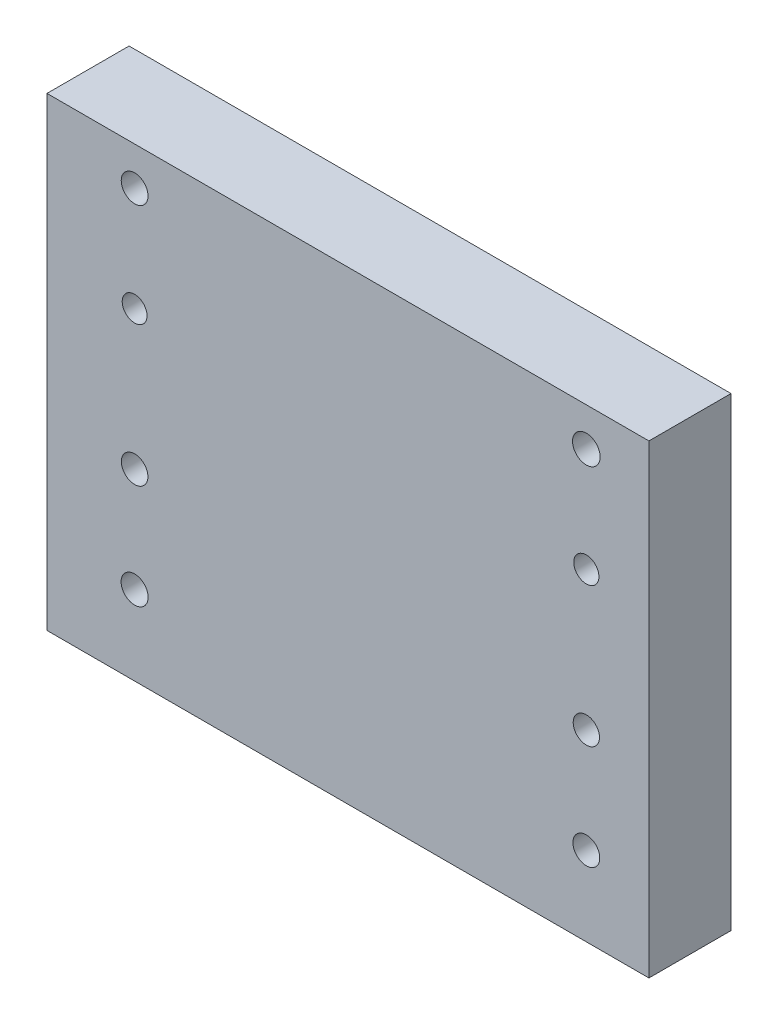
ISO-10303-21;
HEADER;
FILE_DESCRIPTION(('STEP AP214'),'2;1');
FILE_NAME('part.step','',(''),(''),'','','');
FILE_SCHEMA(('AUTOMOTIVE_DESIGN { 1 0 10303 214 1 1 1 1 }'));
ENDSEC;
DATA;
#1=APPLICATION_CONTEXT('core data for automotive mechanical design processes');
#2=APPLICATION_PROTOCOL_DEFINITION('international standard','automotive_design',2000,#1);
#3=PRODUCT_CONTEXT('',#1,'mechanical');
#4=PRODUCT('Part','Part','',(#3));
#5=PRODUCT_RELATED_PRODUCT_CATEGORY('part','',(#4));
#6=PRODUCT_DEFINITION_FORMATION('','',#4);
#7=PRODUCT_DEFINITION_CONTEXT('part definition',#1,'design');
#8=PRODUCT_DEFINITION('design','',#6,#7);
#9=PRODUCT_DEFINITION_SHAPE('','',#8);
#10=(LENGTH_UNIT() NAMED_UNIT(*) SI_UNIT(.MILLI.,.METRE.));
#11=(NAMED_UNIT(*) PLANE_ANGLE_UNIT() SI_UNIT($,.RADIAN.));
#12=(NAMED_UNIT(*) SI_UNIT($,.STERADIAN.) SOLID_ANGLE_UNIT());
#13=UNCERTAINTY_MEASURE_WITH_UNIT(LENGTH_MEASURE(1.E-05),#10,'distance_accuracy_value','');
#14=(GEOMETRIC_REPRESENTATION_CONTEXT(3) GLOBAL_UNCERTAINTY_ASSIGNED_CONTEXT((#13)) GLOBAL_UNIT_ASSIGNED_CONTEXT((#10,
#11,#12)) REPRESENTATION_CONTEXT('',''));
#15=CARTESIAN_POINT('',(0.,0.,0.));
#16=DIRECTION('',(0.,0.,1.));
#17=DIRECTION('',(1.,0.,0.));
#18=AXIS2_PLACEMENT_3D('',#15,#16,#17);
#19=CARTESIAN_POINT('',(0.,0.,30.));
#20=DIRECTION('',(1.,0.,0.));
#21=DIRECTION('',(0.,0.,-1.));
#22=AXIS2_PLACEMENT_3D('',#19,#20,#21);
#23=PLANE('',#22);
#24=DIRECTION('',(0.,-1.,0.));
#25=VECTOR('',#24,1.);
#26=CARTESIAN_POINT('',(0.,0.,0.));
#27=LINE('',#26,#25);
#28=CARTESIAN_POINT('',(0.,170.,0.));
#29=VERTEX_POINT('',#28);
#30=CARTESIAN_POINT('',(0.,0.,0.));
#31=VERTEX_POINT('',#30);
#32=EDGE_CURVE('E96',#29,#31,#27,.T.);
#33=ORIENTED_EDGE('',*,*,#32,.T.);
#34=DIRECTION('',(0.,0.,-1.));
#35=VECTOR('',#34,1.);
#36=CARTESIAN_POINT('',(0.,0.,30.));
#37=LINE('',#36,#35);
#38=CARTESIAN_POINT('',(0.,0.,30.));
#39=VERTEX_POINT('',#38);
#40=EDGE_CURVE('E11',#39,#31,#37,.T.);
#41=ORIENTED_EDGE('',*,*,#40,.F.);
#42=DIRECTION('',(0.,-1.,0.));
#43=VECTOR('',#42,1.);
#44=CARTESIAN_POINT('',(0.,0.,30.));
#45=LINE('',#44,#43);
#46=CARTESIAN_POINT('',(0.,170.,30.));
#47=VERTEX_POINT('',#46);
#48=EDGE_CURVE('E84',#47,#39,#45,.T.);
#49=ORIENTED_EDGE('',*,*,#48,.F.);
#50=DIRECTION('',(0.,0.,-1.));
#51=VECTOR('',#50,1.);
#52=CARTESIAN_POINT('',(0.,170.,30.));
#53=LINE('',#52,#51);
#54=EDGE_CURVE('E92',#47,#29,#53,.T.);
#55=ORIENTED_EDGE('',*,*,#54,.T.);
#56=EDGE_LOOP('',(#33,#41,#49,#55));
#57=FACE_BOUND('',#56,.T.);
#58=ADVANCED_FACE('F33',(#57),#23,.F.);
#59=CARTESIAN_POINT('',(0.,0.,30.));
#60=DIRECTION('',(0.,1.,0.));
#61=DIRECTION('',(0.,0.,1.));
#62=AXIS2_PLACEMENT_3D('',#59,#60,#61);
#63=PLANE('',#62);
#64=DIRECTION('',(1.,0.,0.));
#65=VECTOR('',#64,1.);
#66=CARTESIAN_POINT('',(0.,0.,0.));
#67=LINE('',#66,#65);
#68=CARTESIAN_POINT('',(220.,0.,0.));
#69=VERTEX_POINT('',#68);
#70=EDGE_CURVE('E88',#31,#69,#67,.T.);
#71=ORIENTED_EDGE('',*,*,#70,.T.);
#72=DIRECTION('',(0.,0.,-1.));
#73=VECTOR('',#72,1.);
#74=CARTESIAN_POINT('',(220.,0.,30.));
#75=LINE('',#74,#73);
#76=CARTESIAN_POINT('',(220.,0.,30.));
#77=VERTEX_POINT('',#76);
#78=EDGE_CURVE('E41',#77,#69,#75,.T.);
#79=ORIENTED_EDGE('',*,*,#78,.F.);
#80=DIRECTION('',(1.,0.,0.));
#81=VECTOR('',#80,1.);
#82=CARTESIAN_POINT('',(0.,0.,30.));
#83=LINE('',#82,#81);
#84=EDGE_CURVE('E79',#39,#77,#83,.T.);
#85=ORIENTED_EDGE('',*,*,#84,.F.);
#86=ORIENTED_EDGE('',*,*,#40,.T.);
#87=EDGE_LOOP('',(#71,#79,#85,#86));
#88=FACE_BOUND('',#87,.T.);
#89=ADVANCED_FACE('F87',(#88),#63,.F.);
#90=CARTESIAN_POINT('',(220.,0.,30.));
#91=DIRECTION('',(-1.,0.,0.));
#92=DIRECTION('',(0.,0.,1.));
#93=AXIS2_PLACEMENT_3D('',#90,#91,#92);
#94=PLANE('',#93);
#95=DIRECTION('',(0.,1.,0.));
#96=VECTOR('',#95,1.);
#97=CARTESIAN_POINT('',(220.,0.,0.));
#98=LINE('',#97,#96);
#99=CARTESIAN_POINT('',(220.,170.,0.));
#100=VERTEX_POINT('',#99);
#101=EDGE_CURVE('E66',#69,#100,#98,.T.);
#102=ORIENTED_EDGE('',*,*,#101,.T.);
#103=DIRECTION('',(0.,0.,-1.));
#104=VECTOR('',#103,1.);
#105=CARTESIAN_POINT('',(220.,170.,30.));
#106=LINE('',#105,#104);
#107=CARTESIAN_POINT('',(220.,170.,30.));
#108=VERTEX_POINT('',#107);
#109=EDGE_CURVE('E89',#108,#100,#106,.T.);
#110=ORIENTED_EDGE('',*,*,#109,.F.);
#111=DIRECTION('',(0.,1.,0.));
#112=VECTOR('',#111,1.);
#113=CARTESIAN_POINT('',(220.,0.,30.));
#114=LINE('',#113,#112);
#115=EDGE_CURVE('E82',#77,#108,#114,.T.);
#116=ORIENTED_EDGE('',*,*,#115,.F.);
#117=ORIENTED_EDGE('',*,*,#78,.T.);
#118=EDGE_LOOP('',(#102,#110,#116,#117));
#119=FACE_BOUND('',#118,.T.);
#120=ADVANCED_FACE('F90',(#119),#94,.F.);
#121=CARTESIAN_POINT('',(0.,170.,30.));
#122=DIRECTION('',(0.,-1.,0.));
#123=DIRECTION('',(0.,0.,-1.));
#124=AXIS2_PLACEMENT_3D('',#121,#122,#123);
#125=PLANE('',#124);
#126=DIRECTION('',(-1.,0.,0.));
#127=VECTOR('',#126,1.);
#128=CARTESIAN_POINT('',(0.,170.,0.));
#129=LINE('',#128,#127);
#130=EDGE_CURVE('E72',#100,#29,#129,.T.);
#131=ORIENTED_EDGE('',*,*,#130,.T.);
#132=ORIENTED_EDGE('',*,*,#54,.F.);
#133=DIRECTION('',(-1.,0.,0.));
#134=VECTOR('',#133,1.);
#135=CARTESIAN_POINT('',(0.,170.,30.));
#136=LINE('',#135,#134);
#137=EDGE_CURVE('E49',#108,#47,#136,.T.);
#138=ORIENTED_EDGE('',*,*,#137,.F.);
#139=ORIENTED_EDGE('',*,*,#109,.T.);
#140=EDGE_LOOP('',(#131,#132,#138,#139));
#141=FACE_BOUND('',#140,.T.);
#142=ADVANCED_FACE('F104',(#141),#125,.F.);
#143=CARTESIAN_POINT('',(0.,0.,30.));
#144=DIRECTION('',(0.,0.,-1.));
#145=DIRECTION('',(-1.,0.,0.));
#146=AXIS2_PLACEMENT_3D('',#143,#144,#145);
#147=PLANE('',#146);
#148=CARTESIAN_POINT('',(197.125064526776,67.0767298248199,30.));
#149=DIRECTION('',(0.,0.,-1.));
#150=DIRECTION('',(-1.,0.,0.));
#151=AXIS2_PLACEMENT_3D('',#148,#149,#150);
#152=CIRCLE('',#151,4.80160975387124);
#153=CARTESIAN_POINT('',(192.323454772905,67.0767298248199,30.));
#154=VERTEX_POINT('',#153);
#155=EDGE_CURVE('E113',#154,#154,#152,.T.);
#156=ORIENTED_EDGE('',*,*,#155,.T.);
#157=EDGE_LOOP('',(#156));
#158=FACE_BOUND('',#157,.T.);
#159=CARTESIAN_POINT('',(197.125064526776,117.87672982482,30.));
#160=DIRECTION('',(0.,0.,-1.));
#161=DIRECTION('',(-1.,0.,0.));
#162=AXIS2_PLACEMENT_3D('',#159,#160,#161);
#163=CIRCLE('',#162,4.59981141049048);
#164=CARTESIAN_POINT('',(192.525253116286,117.87672982482,30.));
#165=VERTEX_POINT('',#164);
#166=EDGE_CURVE('E132',#165,#165,#163,.T.);
#167=ORIENTED_EDGE('',*,*,#166,.T.);
#168=EDGE_LOOP('',(#167));
#169=FACE_BOUND('',#168,.T.);
#170=CARTESIAN_POINT('',(197.125064526776,155.97672982482,30.));
#171=DIRECTION('',(0.,0.,-1.));
#172=DIRECTION('',(-1.,0.,0.));
#173=AXIS2_PLACEMENT_3D('',#170,#171,#172);
#174=CIRCLE('',#173,5.04719194809975);
#175=CARTESIAN_POINT('',(192.077872578677,155.97672982482,30.));
#176=VERTEX_POINT('',#175);
#177=EDGE_CURVE('E126',#176,#176,#174,.T.);
#178=ORIENTED_EDGE('',*,*,#177,.T.);
#179=EDGE_LOOP('',(#178));
#180=FACE_BOUND('',#179,.T.);
#181=CARTESIAN_POINT('',(32.0250645267763,155.97672982482,30.));
#182=DIRECTION('',(0.,0.,-1.));
#183=DIRECTION('',(-1.,0.,0.));
#184=AXIS2_PLACEMENT_3D('',#181,#182,#183);
#185=CIRCLE('',#184,4.89669060810815);
#186=CARTESIAN_POINT('',(27.1283739186682,155.97672982482,30.));
#187=VERTEX_POINT('',#186);
#188=EDGE_CURVE('E119',#187,#187,#185,.T.);
#189=ORIENTED_EDGE('',*,*,#188,.T.);
#190=EDGE_LOOP('',(#189));
#191=FACE_BOUND('',#190,.T.);
#192=CARTESIAN_POINT('',(32.0250645267763,117.87672982482,30.));
#193=DIRECTION('',(0.,0.,-1.));
#194=DIRECTION('',(-1.,0.,0.));
#195=AXIS2_PLACEMENT_3D('',#192,#193,#194);
#196=CIRCLE('',#195,4.54013034751855);
#197=CARTESIAN_POINT('',(27.4849341792578,117.87672982482,30.));
#198=VERTEX_POINT('',#197);
#199=EDGE_CURVE('E120',#198,#198,#196,.T.);
#200=ORIENTED_EDGE('',*,*,#199,.T.);
#201=EDGE_LOOP('',(#200));
#202=FACE_BOUND('',#201,.T.);
#203=CARTESIAN_POINT('',(32.0250645267761,67.07672982482,30.));
#204=DIRECTION('',(0.,0.,-1.));
#205=DIRECTION('',(-1.,0.,0.));
#206=AXIS2_PLACEMENT_3D('',#203,#204,#205);
#207=CIRCLE('',#206,4.85509926160658);
#208=CARTESIAN_POINT('',(27.1699652651695,67.07672982482,30.));
#209=VERTEX_POINT('',#208);
#210=EDGE_CURVE('E149',#209,#209,#207,.T.);
#211=ORIENTED_EDGE('',*,*,#210,.T.);
#212=EDGE_LOOP('',(#211));
#213=FACE_BOUND('',#212,.T.);
#214=CARTESIAN_POINT('',(32.0250645267764,28.9767298248202,30.));
#215=DIRECTION('',(0.,0.,-1.));
#216=DIRECTION('',(-1.,0.,0.));
#217=AXIS2_PLACEMENT_3D('',#214,#215,#216);
#218=CIRCLE('',#217,4.93965940461493);
#219=CARTESIAN_POINT('',(27.0854051221615,28.9767298248202,30.));
#220=VERTEX_POINT('',#219);
#221=EDGE_CURVE('E143',#220,#220,#218,.T.);
#222=ORIENTED_EDGE('',*,*,#221,.T.);
#223=EDGE_LOOP('',(#222));
#224=FACE_BOUND('',#223,.T.);
#225=CARTESIAN_POINT('',(197.125064526776,28.9767298248199,30.));
#226=DIRECTION('',(0.,0.,-1.));
#227=DIRECTION('',(-1.,0.,0.));
#228=AXIS2_PLACEMENT_3D('',#225,#226,#227);
#229=CIRCLE('',#228,4.90391275369585);
#230=CARTESIAN_POINT('',(192.22115177308,28.9767298248199,30.));
#231=VERTEX_POINT('',#230);
#232=EDGE_CURVE('E99',#231,#231,#229,.T.);
#233=ORIENTED_EDGE('',*,*,#232,.T.);
#234=EDGE_LOOP('',(#233));
#235=FACE_BOUND('',#234,.T.);
#236=ORIENTED_EDGE('',*,*,#48,.T.);
#237=ORIENTED_EDGE('',*,*,#84,.T.);
#238=ORIENTED_EDGE('',*,*,#115,.T.);
#239=ORIENTED_EDGE('',*,*,#137,.T.);
#240=EDGE_LOOP('',(#236,#237,#238,#239));
#241=FACE_BOUND('',#240,.T.);
#242=ADVANCED_FACE('F80',(#158,#169,#180,#191,#202,#213,#224,#235,#241),#147,.F.);
#243=CARTESIAN_POINT('',(0.,0.,0.));
#244=DIRECTION('',(0.,0.,-1.));
#245=DIRECTION('',(-1.,0.,0.));
#246=AXIS2_PLACEMENT_3D('',#243,#244,#245);
#247=PLANE('',#246);
#248=CARTESIAN_POINT('',(197.125064526776,67.0767298248199,0.));
#249=DIRECTION('',(0.,0.,-1.));
#250=DIRECTION('',(-1.,0.,0.));
#251=AXIS2_PLACEMENT_3D('',#248,#249,#250);
#252=CIRCLE('',#251,4.80160975387124);
#253=CARTESIAN_POINT('',(192.323454772905,67.0767298248199,0.));
#254=VERTEX_POINT('',#253);
#255=EDGE_CURVE('E135',#254,#254,#252,.T.);
#256=ORIENTED_EDGE('',*,*,#255,.F.);
#257=EDGE_LOOP('',(#256));
#258=FACE_BOUND('',#257,.T.);
#259=CARTESIAN_POINT('',(197.125064526776,117.87672982482,0.));
#260=DIRECTION('',(0.,0.,-1.));
#261=DIRECTION('',(-1.,0.,0.));
#262=AXIS2_PLACEMENT_3D('',#259,#260,#261);
#263=CIRCLE('',#262,4.59981141049048);
#264=CARTESIAN_POINT('',(192.525253116286,117.87672982482,0.));
#265=VERTEX_POINT('',#264);
#266=EDGE_CURVE('E129',#265,#265,#263,.T.);
#267=ORIENTED_EDGE('',*,*,#266,.F.);
#268=EDGE_LOOP('',(#267));
#269=FACE_BOUND('',#268,.T.);
#270=CARTESIAN_POINT('',(197.125064526776,155.97672982482,0.));
#271=DIRECTION('',(0.,0.,-1.));
#272=DIRECTION('',(-1.,0.,0.));
#273=AXIS2_PLACEMENT_3D('',#270,#271,#272);
#274=CIRCLE('',#273,5.04719194809975);
#275=CARTESIAN_POINT('',(192.077872578677,155.97672982482,0.));
#276=VERTEX_POINT('',#275);
#277=EDGE_CURVE('E123',#276,#276,#274,.T.);
#278=ORIENTED_EDGE('',*,*,#277,.F.);
#279=EDGE_LOOP('',(#278));
#280=FACE_BOUND('',#279,.T.);
#281=CARTESIAN_POINT('',(32.0250645267763,155.97672982482,0.));
#282=DIRECTION('',(0.,0.,-1.));
#283=DIRECTION('',(-1.,0.,0.));
#284=AXIS2_PLACEMENT_3D('',#281,#282,#283);
#285=CIRCLE('',#284,4.89669060810815);
#286=CARTESIAN_POINT('',(27.1283739186682,155.97672982482,0.));
#287=VERTEX_POINT('',#286);
#288=EDGE_CURVE('E116',#287,#287,#285,.T.);
#289=ORIENTED_EDGE('',*,*,#288,.F.);
#290=EDGE_LOOP('',(#289));
#291=FACE_BOUND('',#290,.T.);
#292=CARTESIAN_POINT('',(32.0250645267763,117.87672982482,0.));
#293=DIRECTION('',(0.,0.,-1.));
#294=DIRECTION('',(-1.,0.,0.));
#295=AXIS2_PLACEMENT_3D('',#292,#293,#294);
#296=CIRCLE('',#295,4.54013034751855);
#297=CARTESIAN_POINT('',(27.4849341792578,117.87672982482,0.));
#298=VERTEX_POINT('',#297);
#299=EDGE_CURVE('E152',#298,#298,#296,.T.);
#300=ORIENTED_EDGE('',*,*,#299,.F.);
#301=EDGE_LOOP('',(#300));
#302=FACE_BOUND('',#301,.T.);
#303=CARTESIAN_POINT('',(32.0250645267761,67.07672982482,0.));
#304=DIRECTION('',(0.,0.,-1.));
#305=DIRECTION('',(-1.,0.,0.));
#306=AXIS2_PLACEMENT_3D('',#303,#304,#305);
#307=CIRCLE('',#306,4.85509926160658);
#308=CARTESIAN_POINT('',(27.1699652651695,67.07672982482,0.));
#309=VERTEX_POINT('',#308);
#310=EDGE_CURVE('E146',#309,#309,#307,.T.);
#311=ORIENTED_EDGE('',*,*,#310,.F.);
#312=EDGE_LOOP('',(#311));
#313=FACE_BOUND('',#312,.T.);
#314=CARTESIAN_POINT('',(32.0250645267764,28.9767298248202,0.));
#315=DIRECTION('',(0.,0.,-1.));
#316=DIRECTION('',(-1.,0.,0.));
#317=AXIS2_PLACEMENT_3D('',#314,#315,#316);
#318=CIRCLE('',#317,4.93965940461493);
#319=CARTESIAN_POINT('',(27.0854051221615,28.9767298248202,0.));
#320=VERTEX_POINT('',#319);
#321=EDGE_CURVE('E140',#320,#320,#318,.T.);
#322=ORIENTED_EDGE('',*,*,#321,.F.);
#323=EDGE_LOOP('',(#322));
#324=FACE_BOUND('',#323,.T.);
#325=CARTESIAN_POINT('',(197.125064526776,28.9767298248199,0.));
#326=DIRECTION('',(0.,0.,-1.));
#327=DIRECTION('',(-1.,0.,0.));
#328=AXIS2_PLACEMENT_3D('',#325,#326,#327);
#329=CIRCLE('',#328,4.90391275369585);
#330=CARTESIAN_POINT('',(192.22115177308,28.9767298248199,0.));
#331=VERTEX_POINT('',#330);
#332=EDGE_CURVE('E110',#331,#331,#329,.T.);
#333=ORIENTED_EDGE('',*,*,#332,.F.);
#334=EDGE_LOOP('',(#333));
#335=FACE_BOUND('',#334,.T.);
#336=ORIENTED_EDGE('',*,*,#32,.F.);
#337=ORIENTED_EDGE('',*,*,#130,.F.);
#338=ORIENTED_EDGE('',*,*,#101,.F.);
#339=ORIENTED_EDGE('',*,*,#70,.F.);
#340=EDGE_LOOP('',(#336,#337,#338,#339));
#341=FACE_BOUND('',#340,.T.);
#342=ADVANCED_FACE('F107',(#258,#269,#280,#291,#302,#313,#324,#335,#341),#247,.T.);
#343=CARTESIAN_POINT('',(197.125064526776,28.9767298248199,30.));
#344=DIRECTION('',(0.,0.,-1.));
#345=DIRECTION('',(-1.,0.,0.));
#346=AXIS2_PLACEMENT_3D('',#343,#344,#345);
#347=CYLINDRICAL_SURFACE('',#346,4.90391275369585);
#348=ORIENTED_EDGE('',*,*,#232,.F.);
#349=EDGE_LOOP('',(#348));
#350=FACE_BOUND('',#349,.T.);
#351=ORIENTED_EDGE('',*,*,#332,.T.);
#352=EDGE_LOOP('',(#351));
#353=FACE_BOUND('',#352,.T.);
#354=ADVANCED_FACE('F170',(#350,#353),#347,.F.);
#355=CARTESIAN_POINT('',(32.0250645267764,28.9767298248202,30.));
#356=DIRECTION('',(0.,0.,-1.));
#357=DIRECTION('',(-1.,0.,0.));
#358=AXIS2_PLACEMENT_3D('',#355,#356,#357);
#359=CYLINDRICAL_SURFACE('',#358,4.93965940461493);
#360=ORIENTED_EDGE('',*,*,#221,.F.);
#361=EDGE_LOOP('',(#360));
#362=FACE_BOUND('',#361,.T.);
#363=ORIENTED_EDGE('',*,*,#321,.T.);
#364=EDGE_LOOP('',(#363));
#365=FACE_BOUND('',#364,.T.);
#366=ADVANCED_FACE('F180',(#362,#365),#359,.F.);
#367=CARTESIAN_POINT('',(32.0250645267761,67.07672982482,30.));
#368=DIRECTION('',(0.,0.,-1.));
#369=DIRECTION('',(-1.,0.,0.));
#370=AXIS2_PLACEMENT_3D('',#367,#368,#369);
#371=CYLINDRICAL_SURFACE('',#370,4.85509926160658);
#372=ORIENTED_EDGE('',*,*,#210,.F.);
#373=EDGE_LOOP('',(#372));
#374=FACE_BOUND('',#373,.T.);
#375=ORIENTED_EDGE('',*,*,#310,.T.);
#376=EDGE_LOOP('',(#375));
#377=FACE_BOUND('',#376,.T.);
#378=ADVANCED_FACE('F164',(#374,#377),#371,.F.);
#379=CARTESIAN_POINT('',(32.0250645267763,117.87672982482,30.));
#380=DIRECTION('',(0.,0.,-1.));
#381=DIRECTION('',(-1.,0.,0.));
#382=AXIS2_PLACEMENT_3D('',#379,#380,#381);
#383=CYLINDRICAL_SURFACE('',#382,4.54013034751855);
#384=ORIENTED_EDGE('',*,*,#199,.F.);
#385=EDGE_LOOP('',(#384));
#386=FACE_BOUND('',#385,.T.);
#387=ORIENTED_EDGE('',*,*,#299,.T.);
#388=EDGE_LOOP('',(#387));
#389=FACE_BOUND('',#388,.T.);
#390=ADVANCED_FACE('F160',(#386,#389),#383,.F.);
#391=CARTESIAN_POINT('',(32.0250645267763,155.97672982482,30.));
#392=DIRECTION('',(0.,0.,-1.));
#393=DIRECTION('',(-1.,0.,0.));
#394=AXIS2_PLACEMENT_3D('',#391,#392,#393);
#395=CYLINDRICAL_SURFACE('',#394,4.89669060810815);
#396=ORIENTED_EDGE('',*,*,#188,.F.);
#397=EDGE_LOOP('',(#396));
#398=FACE_BOUND('',#397,.T.);
#399=ORIENTED_EDGE('',*,*,#288,.T.);
#400=EDGE_LOOP('',(#399));
#401=FACE_BOUND('',#400,.T.);
#402=ADVANCED_FACE('F163',(#398,#401),#395,.F.);
#403=CARTESIAN_POINT('',(197.125064526776,155.97672982482,30.));
#404=DIRECTION('',(0.,0.,-1.));
#405=DIRECTION('',(-1.,0.,0.));
#406=AXIS2_PLACEMENT_3D('',#403,#404,#405);
#407=CYLINDRICAL_SURFACE('',#406,5.04719194809975);
#408=ORIENTED_EDGE('',*,*,#177,.F.);
#409=EDGE_LOOP('',(#408));
#410=FACE_BOUND('',#409,.T.);
#411=ORIENTED_EDGE('',*,*,#277,.T.);
#412=EDGE_LOOP('',(#411));
#413=FACE_BOUND('',#412,.T.);
#414=ADVANCED_FACE('F215',(#410,#413),#407,.F.);
#415=CARTESIAN_POINT('',(197.125064526776,117.87672982482,30.));
#416=DIRECTION('',(0.,0.,-1.));
#417=DIRECTION('',(-1.,0.,0.));
#418=AXIS2_PLACEMENT_3D('',#415,#416,#417);
#419=CYLINDRICAL_SURFACE('',#418,4.59981141049048);
#420=ORIENTED_EDGE('',*,*,#166,.F.);
#421=EDGE_LOOP('',(#420));
#422=FACE_BOUND('',#421,.T.);
#423=ORIENTED_EDGE('',*,*,#266,.T.);
#424=EDGE_LOOP('',(#423));
#425=FACE_BOUND('',#424,.T.);
#426=ADVANCED_FACE('F221',(#422,#425),#419,.F.);
#427=CARTESIAN_POINT('',(197.125064526776,67.0767298248199,30.));
#428=DIRECTION('',(0.,0.,-1.));
#429=DIRECTION('',(-1.,0.,0.));
#430=AXIS2_PLACEMENT_3D('',#427,#428,#429);
#431=CYLINDRICAL_SURFACE('',#430,4.80160975387124);
#432=ORIENTED_EDGE('',*,*,#155,.F.);
#433=EDGE_LOOP('',(#432));
#434=FACE_BOUND('',#433,.T.);
#435=ORIENTED_EDGE('',*,*,#255,.T.);
#436=EDGE_LOOP('',(#435));
#437=FACE_BOUND('',#436,.T.);
#438=ADVANCED_FACE('F227',(#434,#437),#431,.F.);
#439=CLOSED_SHELL('',(#58,#89,#120,#142,#242,#342,#354,#366,#378,#390,#402,#414,#426,#438));
#440=MANIFOLD_SOLID_BREP('B2',#439);
#441=ADVANCED_BREP_SHAPE_REPRESENTATION('',(#18,#440),#14);
#442=SHAPE_DEFINITION_REPRESENTATION(#9,#441);
ENDSEC;
END-ISO-10303-21;
